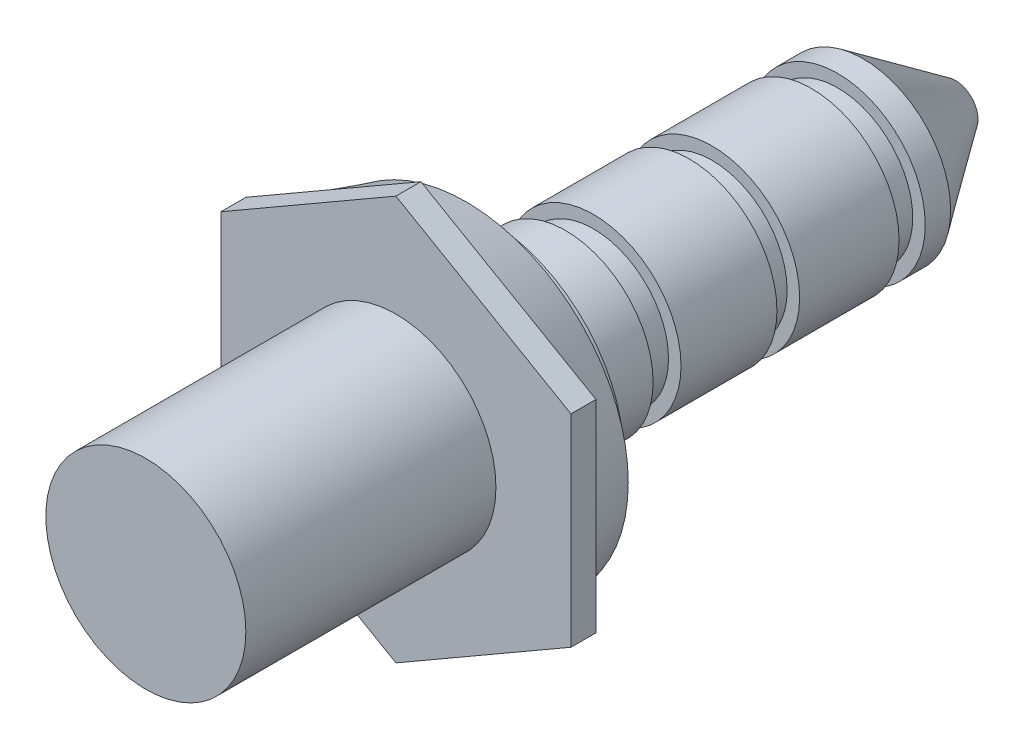
ISO-10303-21;
HEADER;
FILE_DESCRIPTION(('STEP AP214'),'2;1');
FILE_NAME('part.step','',(''),(''),'','','');
FILE_SCHEMA(('AUTOMOTIVE_DESIGN { 1 0 10303 214 1 1 1 1 }'));
ENDSEC;
DATA;
#1=APPLICATION_CONTEXT('core data for automotive mechanical design processes');
#2=APPLICATION_PROTOCOL_DEFINITION('international standard','automotive_design',2000,#1);
#3=PRODUCT_CONTEXT('',#1,'mechanical');
#4=PRODUCT('Part','Part','',(#3));
#5=PRODUCT_RELATED_PRODUCT_CATEGORY('part','',(#4));
#6=PRODUCT_DEFINITION_FORMATION('','',#4);
#7=PRODUCT_DEFINITION_CONTEXT('part definition',#1,'design');
#8=PRODUCT_DEFINITION('design','',#6,#7);
#9=PRODUCT_DEFINITION_SHAPE('','',#8);
#10=(LENGTH_UNIT() NAMED_UNIT(*) SI_UNIT(.MILLI.,.METRE.));
#11=(NAMED_UNIT(*) PLANE_ANGLE_UNIT() SI_UNIT($,.RADIAN.));
#12=(NAMED_UNIT(*) SI_UNIT($,.STERADIAN.) SOLID_ANGLE_UNIT());
#13=UNCERTAINTY_MEASURE_WITH_UNIT(LENGTH_MEASURE(1.E-05),#10,'distance_accuracy_value','');
#14=(GEOMETRIC_REPRESENTATION_CONTEXT(3) GLOBAL_UNCERTAINTY_ASSIGNED_CONTEXT((#13)) GLOBAL_UNIT_ASSIGNED_CONTEXT((#10,
#11,#12)) REPRESENTATION_CONTEXT('',''));
#15=CARTESIAN_POINT('',(0.,0.,0.));
#16=DIRECTION('',(0.,0.,1.));
#17=DIRECTION('',(1.,0.,0.));
#18=AXIS2_PLACEMENT_3D('',#15,#16,#17);
#19=CARTESIAN_POINT('',(0.,0.,0.));
#20=DIRECTION('',(0.,0.,1.));
#21=DIRECTION('',(1.,0.,0.));
#22=AXIS2_PLACEMENT_3D('',#19,#20,#21);
#23=PLANE('',#22);
#24=DIRECTION('',(0.,1.,0.));
#25=VECTOR('',#24,1.);
#26=CARTESIAN_POINT('',(7.,-4.04145188432738,0.));
#27=LINE('',#26,#25);
#28=CARTESIAN_POINT('',(7.,0.,0.));
#29=VERTEX_POINT('',#28);
#30=CARTESIAN_POINT('',(7.,4.04145188432738,0.));
#31=VERTEX_POINT('',#30);
#32=EDGE_CURVE('E143',#29,#31,#27,.T.);
#33=ORIENTED_EDGE('',*,*,#32,.F.);
#34=CARTESIAN_POINT('',(0.,0.,0.));
#35=DIRECTION('',(0.,0.,1.));
#36=DIRECTION('',(1.,0.,0.));
#37=AXIS2_PLACEMENT_3D('',#34,#35,#36);
#38=CIRCLE('',#37,7.);
#39=CARTESIAN_POINT('',(3.5,6.06217782649107,0.));
#40=VERTEX_POINT('',#39);
#41=EDGE_CURVE('E44',#29,#40,#38,.T.);
#42=ORIENTED_EDGE('',*,*,#41,.T.);
#43=DIRECTION('',(-0.866025403784439,0.5,0.));
#44=VECTOR('',#43,1.);
#45=CARTESIAN_POINT('',(7.,4.04145188432738,0.));
#46=LINE('',#45,#44);
#47=EDGE_CURVE('E147',#31,#40,#46,.T.);
#48=ORIENTED_EDGE('',*,*,#47,.F.);
#49=EDGE_LOOP('',(#33,#42,#48));
#50=FACE_BOUND('',#49,.T.);
#51=ADVANCED_FACE('F33',(#50),#23,.F.);
#52=CARTESIAN_POINT('',(0.,8.08290376865476,0.));
#53=VERTEX_POINT('',#52);
#54=EDGE_CURVE('E121',#40,#53,#46,.T.);
#55=ORIENTED_EDGE('',*,*,#54,.F.);
#56=CARTESIAN_POINT('',(-3.5,6.06217782649107,0.));
#57=VERTEX_POINT('',#56);
#58=EDGE_CURVE('E11',#40,#57,#38,.T.);
#59=ORIENTED_EDGE('',*,*,#58,.T.);
#60=DIRECTION('',(-0.866025403784439,-0.5,0.));
#61=VECTOR('',#60,1.);
#62=CARTESIAN_POINT('',(0.,8.08290376865476,0.));
#63=LINE('',#62,#61);
#64=EDGE_CURVE('E150',#53,#57,#63,.T.);
#65=ORIENTED_EDGE('',*,*,#64,.F.);
#66=EDGE_LOOP('',(#55,#59,#65));
#67=FACE_BOUND('',#66,.T.);
#68=ADVANCED_FACE('F263',(#67),#23,.F.);
#69=CARTESIAN_POINT('',(-7.,4.04145188432738,0.));
#70=VERTEX_POINT('',#69);
#71=EDGE_CURVE('E149',#57,#70,#63,.T.);
#72=ORIENTED_EDGE('',*,*,#71,.F.);
#73=CARTESIAN_POINT('',(-7.,0.,0.));
#74=VERTEX_POINT('',#73);
#75=EDGE_CURVE('E42',#57,#74,#38,.T.);
#76=ORIENTED_EDGE('',*,*,#75,.T.);
#77=DIRECTION('',(0.,-1.,0.));
#78=VECTOR('',#77,1.);
#79=CARTESIAN_POINT('',(-7.,4.04145188432738,0.));
#80=LINE('',#79,#78);
#81=EDGE_CURVE('E152',#70,#74,#80,.T.);
#82=ORIENTED_EDGE('',*,*,#81,.F.);
#83=EDGE_LOOP('',(#72,#76,#82));
#84=FACE_BOUND('',#83,.T.);
#85=ADVANCED_FACE('F258',(#84),#23,.F.);
#86=CARTESIAN_POINT('',(-7.,-4.04145188432738,0.));
#87=VERTEX_POINT('',#86);
#88=EDGE_CURVE('E86',#74,#87,#80,.T.);
#89=ORIENTED_EDGE('',*,*,#88,.F.);
#90=CARTESIAN_POINT('',(-3.5,-6.06217782649107,0.));
#91=VERTEX_POINT('',#90);
#92=EDGE_CURVE('E168',#74,#91,#38,.T.);
#93=ORIENTED_EDGE('',*,*,#92,.T.);
#94=DIRECTION('',(0.866025403784439,-0.5,0.));
#95=VECTOR('',#94,1.);
#96=CARTESIAN_POINT('',(-7.,-4.04145188432738,0.));
#97=LINE('',#96,#95);
#98=EDGE_CURVE('E135',#87,#91,#97,.T.);
#99=ORIENTED_EDGE('',*,*,#98,.F.);
#100=EDGE_LOOP('',(#89,#93,#99));
#101=FACE_BOUND('',#100,.T.);
#102=ADVANCED_FACE('F254',(#101),#23,.F.);
#103=CARTESIAN_POINT('',(0.,-8.08290376865476,0.));
#104=VERTEX_POINT('',#103);
#105=EDGE_CURVE('E139',#91,#104,#97,.T.);
#106=ORIENTED_EDGE('',*,*,#105,.F.);
#107=CARTESIAN_POINT('',(3.5,-6.06217782649107,0.));
#108=VERTEX_POINT('',#107);
#109=EDGE_CURVE('E163',#91,#108,#38,.T.);
#110=ORIENTED_EDGE('',*,*,#109,.T.);
#111=DIRECTION('',(0.866025403784439,0.5,0.));
#112=VECTOR('',#111,1.);
#113=CARTESIAN_POINT('',(0.,-8.08290376865476,0.));
#114=LINE('',#113,#112);
#115=EDGE_CURVE('E140',#104,#108,#114,.T.);
#116=ORIENTED_EDGE('',*,*,#115,.F.);
#117=EDGE_LOOP('',(#106,#110,#116));
#118=FACE_BOUND('',#117,.T.);
#119=ADVANCED_FACE('F244',(#118),#23,.F.);
#120=CARTESIAN_POINT('',(-7.,-4.04145188432738,1.));
#121=DIRECTION('',(0.5,0.866025403784439,0.));
#122=DIRECTION('',(-0.866025403784439,0.5,0.));
#123=AXIS2_PLACEMENT_3D('',#120,#121,#122);
#124=PLANE('',#123);
#125=ORIENTED_EDGE('',*,*,#98,.T.);
#126=ORIENTED_EDGE('',*,*,#105,.T.);
#127=DIRECTION('',(0.,0.,-1.));
#128=VECTOR('',#127,1.);
#129=CARTESIAN_POINT('',(0.,-8.08290376865476,1.));
#130=LINE('',#129,#128);
#131=CARTESIAN_POINT('',(0.,-8.08290376865476,1.));
#132=VERTEX_POINT('',#131);
#133=EDGE_CURVE('E37',#132,#104,#130,.T.);
#134=ORIENTED_EDGE('',*,*,#133,.F.);
#135=DIRECTION('',(0.866025403784439,-0.5,0.));
#136=VECTOR('',#135,1.);
#137=CARTESIAN_POINT('',(-7.,-4.04145188432738,1.));
#138=LINE('',#137,#136);
#139=CARTESIAN_POINT('',(-7.,-4.04145188432738,1.));
#140=VERTEX_POINT('',#139);
#141=EDGE_CURVE('E154',#140,#132,#138,.T.);
#142=ORIENTED_EDGE('',*,*,#141,.F.);
#143=DIRECTION('',(0.,0.,-1.));
#144=VECTOR('',#143,1.);
#145=CARTESIAN_POINT('',(-7.,-4.04145188432738,1.));
#146=LINE('',#145,#144);
#147=EDGE_CURVE('E131',#140,#87,#146,.T.);
#148=ORIENTED_EDGE('',*,*,#147,.T.);
#149=EDGE_LOOP('',(#125,#126,#134,#142,#148));
#150=FACE_BOUND('',#149,.T.);
#151=ADVANCED_FACE('F35',(#150),#124,.F.);
#152=CARTESIAN_POINT('',(0.,-8.08290376865476,1.));
#153=DIRECTION('',(-0.5,0.866025403784439,0.));
#154=DIRECTION('',(-0.866025403784439,-0.5,0.));
#155=AXIS2_PLACEMENT_3D('',#152,#153,#154);
#156=PLANE('',#155);
#157=ORIENTED_EDGE('',*,*,#115,.T.);
#158=CARTESIAN_POINT('',(7.,-4.04145188432738,0.));
#159=VERTEX_POINT('',#158);
#160=EDGE_CURVE('E138',#108,#159,#114,.T.);
#161=ORIENTED_EDGE('',*,*,#160,.T.);
#162=DIRECTION('',(0.,0.,-1.));
#163=VECTOR('',#162,1.);
#164=CARTESIAN_POINT('',(7.,-4.04145188432738,1.));
#165=LINE('',#164,#163);
#166=CARTESIAN_POINT('',(7.,-4.04145188432738,1.));
#167=VERTEX_POINT('',#166);
#168=EDGE_CURVE('E157',#167,#159,#165,.T.);
#169=ORIENTED_EDGE('',*,*,#168,.F.);
#170=DIRECTION('',(0.866025403784439,0.5,0.));
#171=VECTOR('',#170,1.);
#172=CARTESIAN_POINT('',(0.,-8.08290376865476,1.));
#173=LINE('',#172,#171);
#174=EDGE_CURVE('E95',#132,#167,#173,.T.);
#175=ORIENTED_EDGE('',*,*,#174,.F.);
#176=ORIENTED_EDGE('',*,*,#133,.T.);
#177=EDGE_LOOP('',(#157,#161,#169,#175,#176));
#178=FACE_BOUND('',#177,.T.);
#179=ADVANCED_FACE('F237',(#178),#156,.F.);
#180=CARTESIAN_POINT('',(7.,-4.04145188432738,1.));
#181=DIRECTION('',(-1.,0.,0.));
#182=DIRECTION('',(0.,-1.,0.));
#183=AXIS2_PLACEMENT_3D('',#180,#181,#182);
#184=PLANE('',#183);
#185=EDGE_CURVE('E144',#159,#29,#27,.T.);
#186=ORIENTED_EDGE('',*,*,#185,.T.);
#187=ORIENTED_EDGE('',*,*,#32,.T.);
#188=DIRECTION('',(0.,0.,-1.));
#189=VECTOR('',#188,1.);
#190=CARTESIAN_POINT('',(7.,4.04145188432738,1.));
#191=LINE('',#190,#189);
#192=CARTESIAN_POINT('',(7.,4.04145188432738,1.));
#193=VERTEX_POINT('',#192);
#194=EDGE_CURVE('E125',#193,#31,#191,.T.);
#195=ORIENTED_EDGE('',*,*,#194,.F.);
#196=DIRECTION('',(0.,1.,0.));
#197=VECTOR('',#196,1.);
#198=CARTESIAN_POINT('',(7.,-4.04145188432738,1.));
#199=LINE('',#198,#197);
#200=EDGE_CURVE('E111',#167,#193,#199,.T.);
#201=ORIENTED_EDGE('',*,*,#200,.F.);
#202=ORIENTED_EDGE('',*,*,#168,.T.);
#203=EDGE_LOOP('',(#186,#187,#195,#201,#202));
#204=FACE_BOUND('',#203,.T.);
#205=ADVANCED_FACE('F238',(#204),#184,.F.);
#206=CARTESIAN_POINT('',(7.,4.04145188432738,1.));
#207=DIRECTION('',(-0.5,-0.866025403784439,0.));
#208=DIRECTION('',(0.866025403784439,-0.5,0.));
#209=AXIS2_PLACEMENT_3D('',#206,#207,#208);
#210=PLANE('',#209);
#211=ORIENTED_EDGE('',*,*,#47,.T.);
#212=ORIENTED_EDGE('',*,*,#54,.T.);
#213=DIRECTION('',(0.,0.,-1.));
#214=VECTOR('',#213,1.);
#215=CARTESIAN_POINT('',(0.,8.08290376865476,1.));
#216=LINE('',#215,#214);
#217=CARTESIAN_POINT('',(0.,8.08290376865476,1.));
#218=VERTEX_POINT('',#217);
#219=EDGE_CURVE('E117',#218,#53,#216,.T.);
#220=ORIENTED_EDGE('',*,*,#219,.F.);
#221=DIRECTION('',(-0.866025403784439,0.5,0.));
#222=VECTOR('',#221,1.);
#223=CARTESIAN_POINT('',(7.,4.04145188432738,1.));
#224=LINE('',#223,#222);
#225=EDGE_CURVE('E104',#193,#218,#224,.T.);
#226=ORIENTED_EDGE('',*,*,#225,.F.);
#227=ORIENTED_EDGE('',*,*,#194,.T.);
#228=EDGE_LOOP('',(#211,#212,#220,#226,#227));
#229=FACE_BOUND('',#228,.T.);
#230=ADVANCED_FACE('F119',(#229),#210,.F.);
#231=CARTESIAN_POINT('',(0.,8.08290376865476,1.));
#232=DIRECTION('',(0.5,-0.866025403784439,0.));
#233=DIRECTION('',(0.866025403784439,0.5,0.));
#234=AXIS2_PLACEMENT_3D('',#231,#232,#233);
#235=PLANE('',#234);
#236=ORIENTED_EDGE('',*,*,#64,.T.);
#237=ORIENTED_EDGE('',*,*,#71,.T.);
#238=DIRECTION('',(0.,0.,-1.));
#239=VECTOR('',#238,1.);
#240=CARTESIAN_POINT('',(-7.,4.04145188432738,1.));
#241=LINE('',#240,#239);
#242=CARTESIAN_POINT('',(-7.,4.04145188432738,1.));
#243=VERTEX_POINT('',#242);
#244=EDGE_CURVE('E126',#243,#70,#241,.T.);
#245=ORIENTED_EDGE('',*,*,#244,.F.);
#246=DIRECTION('',(-0.866025403784439,-0.5,0.));
#247=VECTOR('',#246,1.);
#248=CARTESIAN_POINT('',(0.,8.08290376865476,1.));
#249=LINE('',#248,#247);
#250=EDGE_CURVE('E108',#218,#243,#249,.T.);
#251=ORIENTED_EDGE('',*,*,#250,.F.);
#252=ORIENTED_EDGE('',*,*,#219,.T.);
#253=EDGE_LOOP('',(#236,#237,#245,#251,#252));
#254=FACE_BOUND('',#253,.T.);
#255=ADVANCED_FACE('F128',(#254),#235,.F.);
#256=CARTESIAN_POINT('',(-7.,4.04145188432738,1.));
#257=DIRECTION('',(1.,0.,0.));
#258=DIRECTION('',(0.,0.,-1.));
#259=AXIS2_PLACEMENT_3D('',#256,#257,#258);
#260=PLANE('',#259);
#261=ORIENTED_EDGE('',*,*,#81,.T.);
#262=ORIENTED_EDGE('',*,*,#88,.T.);
#263=ORIENTED_EDGE('',*,*,#147,.F.);
#264=DIRECTION('',(0.,-1.,0.));
#265=VECTOR('',#264,1.);
#266=CARTESIAN_POINT('',(-7.,4.04145188432738,1.));
#267=LINE('',#266,#265);
#268=EDGE_CURVE('E59',#243,#140,#267,.T.);
#269=ORIENTED_EDGE('',*,*,#268,.F.);
#270=ORIENTED_EDGE('',*,*,#244,.T.);
#271=EDGE_LOOP('',(#261,#262,#263,#269,#270));
#272=FACE_BOUND('',#271,.T.);
#273=ADVANCED_FACE('F265',(#272),#260,.F.);
#274=CARTESIAN_POINT('',(0.,0.,1.));
#275=DIRECTION('',(0.,0.,1.));
#276=DIRECTION('',(1.,0.,0.));
#277=AXIS2_PLACEMENT_3D('',#274,#275,#276);
#278=PLANE('',#277);
#279=CARTESIAN_POINT('',(0.,0.,1.));
#280=DIRECTION('',(0.,0.,1.));
#281=DIRECTION('',(1.,0.,0.));
#282=AXIS2_PLACEMENT_3D('',#279,#280,#281);
#283=CIRCLE('',#282,4.);
#284=CARTESIAN_POINT('',(4.,0.,1.));
#285=VERTEX_POINT('',#284);
#286=EDGE_CURVE('E229',#285,#285,#283,.T.);
#287=ORIENTED_EDGE('',*,*,#286,.F.);
#288=EDGE_LOOP('',(#287));
#289=FACE_BOUND('',#288,.T.);
#290=ORIENTED_EDGE('',*,*,#141,.T.);
#291=ORIENTED_EDGE('',*,*,#174,.T.);
#292=ORIENTED_EDGE('',*,*,#200,.T.);
#293=ORIENTED_EDGE('',*,*,#225,.T.);
#294=ORIENTED_EDGE('',*,*,#250,.T.);
#295=ORIENTED_EDGE('',*,*,#268,.T.);
#296=EDGE_LOOP('',(#290,#291,#292,#293,#294,#295));
#297=FACE_BOUND('',#296,.T.);
#298=ADVANCED_FACE('F106',(#289,#297),#278,.T.);
#299=ORIENTED_EDGE('',*,*,#160,.F.);
#300=EDGE_CURVE('E161',#108,#29,#38,.T.);
#301=ORIENTED_EDGE('',*,*,#300,.T.);
#302=ORIENTED_EDGE('',*,*,#185,.F.);
#303=EDGE_LOOP('',(#299,#301,#302));
#304=FACE_BOUND('',#303,.T.);
#305=ADVANCED_FACE('F239',(#304),#23,.F.);
#306=CARTESIAN_POINT('',(0.,0.,11.));
#307=DIRECTION('',(0.,0.,-1.));
#308=DIRECTION('',(-1.,0.,0.));
#309=AXIS2_PLACEMENT_3D('',#306,#307,#308);
#310=CYLINDRICAL_SURFACE('',#309,4.);
#311=CARTESIAN_POINT('',(0.,0.,11.));
#312=DIRECTION('',(0.,0.,1.));
#313=DIRECTION('',(1.,0.,0.));
#314=AXIS2_PLACEMENT_3D('',#311,#312,#313);
#315=CIRCLE('',#314,4.);
#316=CARTESIAN_POINT('',(4.,0.,11.));
#317=VERTEX_POINT('',#316);
#318=EDGE_CURVE('E230',#317,#317,#315,.T.);
#319=ORIENTED_EDGE('',*,*,#318,.F.);
#320=EDGE_LOOP('',(#319));
#321=FACE_BOUND('',#320,.T.);
#322=ORIENTED_EDGE('',*,*,#286,.T.);
#323=EDGE_LOOP('',(#322));
#324=FACE_BOUND('',#323,.T.);
#325=ADVANCED_FACE('F280',(#321,#324),#310,.T.);
#326=CARTESIAN_POINT('',(0.,0.,11.));
#327=DIRECTION('',(0.,0.,1.));
#328=DIRECTION('',(1.,0.,0.));
#329=AXIS2_PLACEMENT_3D('',#326,#327,#328);
#330=PLANE('',#329);
#331=ORIENTED_EDGE('',*,*,#318,.T.);
#332=EDGE_LOOP('',(#331));
#333=FACE_BOUND('',#332,.T.);
#334=ADVANCED_FACE('F285',(#333),#330,.T.);
#335=CARTESIAN_POINT('',(0.,0.,-21.3821255905452));
#336=DIRECTION('',(0.,0.,-1.));
#337=DIRECTION('',(-1.,0.,0.));
#338=AXIS2_PLACEMENT_3D('',#335,#336,#337);
#339=PLANE('',#338);
#340=CARTESIAN_POINT('',(0.,0.,-21.3821255905452));
#341=DIRECTION('',(0.,0.,1.));
#342=DIRECTION('',(1.,0.,0.));
#343=AXIS2_PLACEMENT_3D('',#340,#341,#342);
#344=CIRCLE('',#343,0.894479356480703);
#345=CARTESIAN_POINT('',(0.894479356480702,0.,-21.3821255905452));
#346=VERTEX_POINT('',#345);
#347=EDGE_CURVE('E226',#346,#346,#344,.T.);
#348=ORIENTED_EDGE('',*,*,#347,.F.);
#349=EDGE_LOOP('',(#348));
#350=FACE_BOUND('',#349,.T.);
#351=ADVANCED_FACE('F296',(#350),#339,.T.);
#352=CARTESIAN_POINT('',(0.,0.,-17.6825292365084));
#353=DIRECTION('',(0.,0.,1.));
#354=DIRECTION('',(1.,0.,0.));
#355=AXIS2_PLACEMENT_3D('',#352,#353,#354);
#356=CONICAL_SURFACE('',#355,3.5,0.613587060562772);
#357=CARTESIAN_POINT('',(0.,0.,-17.6825292365084));
#358=DIRECTION('',(0.,0.,1.));
#359=DIRECTION('',(1.,0.,0.));
#360=AXIS2_PLACEMENT_3D('',#357,#358,#359);
#361=CIRCLE('',#360,3.5);
#362=CARTESIAN_POINT('',(3.5,0.,-17.6825292365084));
#363=VERTEX_POINT('',#362);
#364=EDGE_CURVE('E223',#363,#363,#361,.T.);
#365=CARTESIAN_POINT('',(0.894479356480702,0.,-21.3821255905452));
#366=CARTESIAN_POINT('',(0.921620196517361,0.,-21.3435881285239));
#367=CARTESIAN_POINT('',(0.94876103655402,0.,-21.3050506665027));
#368=CARTESIAN_POINT('',(1.00304271662734,0.,-21.2279757424603));
#369=CARTESIAN_POINT('',(1.030183556664,0.,-21.1894382804391));
#370=CARTESIAN_POINT('',(1.08446523673732,0.,-21.1123633563966));
#371=CARTESIAN_POINT('',(1.11160607677398,0.,-21.0738258943754));
#372=CARTESIAN_POINT('',(1.16588775684729,0.,-20.996750970333));
#373=CARTESIAN_POINT('',(1.19302859688395,0.,-20.9582135083118));
#374=CARTESIAN_POINT('',(1.24731027695727,0.,-20.8811385842693));
#375=CARTESIAN_POINT('',(1.27445111699393,0.,-20.8426011222481));
#376=CARTESIAN_POINT('',(1.32873279706725,0.,-20.7655261982057));
#377=CARTESIAN_POINT('',(1.35587363710391,0.,-20.7269887361845));
#378=CARTESIAN_POINT('',(1.41015531717723,0.,-20.649913812142));
#379=CARTESIAN_POINT('',(1.43729615721389,0.,-20.6113763501208));
#380=CARTESIAN_POINT('',(1.49157783728721,0.,-20.5343014260784));
#381=CARTESIAN_POINT('',(1.51871867732387,0.,-20.4957639640572));
#382=CARTESIAN_POINT('',(1.57300035739719,0.,-20.4186890400148));
#383=CARTESIAN_POINT('',(1.60014119743384,0.,-20.3801515779935));
#384=CARTESIAN_POINT('',(1.65442287750716,0.,-20.3030766539511));
#385=CARTESIAN_POINT('',(1.68156371754382,0.,-20.2645391919299));
#386=CARTESIAN_POINT('',(1.73584539761714,0.,-20.1874642678875));
#387=CARTESIAN_POINT('',(1.7629862376538,0.,-20.1489268058662));
#388=CARTESIAN_POINT('',(1.81726791772712,0.,-20.0718518818238));
#389=CARTESIAN_POINT('',(1.84440875776378,0.,-20.0333144198026));
#390=CARTESIAN_POINT('',(1.8986904378371,0.,-19.9562394957602));
#391=CARTESIAN_POINT('',(1.92583127787376,0.,-19.9177020337389));
#392=CARTESIAN_POINT('',(1.98011295794708,0.,-19.8406271096965));
#393=CARTESIAN_POINT('',(2.00725379798373,0.,-19.8020896476753));
#394=CARTESIAN_POINT('',(2.06153547805705,0.,-19.7250147236329));
#395=CARTESIAN_POINT('',(2.08867631809371,0.,-19.6864772616116));
#396=CARTESIAN_POINT('',(2.14295799816703,0.,-19.6094023375692));
#397=CARTESIAN_POINT('',(2.17009883820369,0.,-19.570864875548));
#398=CARTESIAN_POINT('',(2.22438051827701,0.,-19.4937899515056));
#399=CARTESIAN_POINT('',(2.25152135831367,0.,-19.4552524894844));
#400=CARTESIAN_POINT('',(2.30580303838699,0.,-19.3781775654419));
#401=CARTESIAN_POINT('',(2.33294387842365,0.,-19.3396401034207));
#402=CARTESIAN_POINT('',(2.38722555849697,0.,-19.2625651793783));
#403=CARTESIAN_POINT('',(2.41436639853363,0.,-19.2240277173571));
#404=CARTESIAN_POINT('',(2.46864807860694,0.,-19.1469527933146));
#405=CARTESIAN_POINT('',(2.4957889186436,0.,-19.1084153312934));
#406=CARTESIAN_POINT('',(2.55007059871692,0.,-19.031340407251));
#407=CARTESIAN_POINT('',(2.57721143875358,0.,-18.9928029452298));
#408=CARTESIAN_POINT('',(2.6314931188269,0.,-18.9157280211873));
#409=CARTESIAN_POINT('',(2.65863395886356,0.,-18.8771905591661));
#410=CARTESIAN_POINT('',(2.71291563893688,0.,-18.8001156351237));
#411=CARTESIAN_POINT('',(2.74005647897354,0.,-18.7615781731025));
#412=CARTESIAN_POINT('',(2.79433815904686,0.,-18.68450324906));
#413=CARTESIAN_POINT('',(2.82147899908352,0.,-18.6459657870388));
#414=CARTESIAN_POINT('',(2.87576067915683,0.,-18.5688908629964));
#415=CARTESIAN_POINT('',(2.90290151919349,0.,-18.5303534009752));
#416=CARTESIAN_POINT('',(2.95718319926681,0.,-18.4532784769327));
#417=CARTESIAN_POINT('',(2.98432403930347,0.,-18.4147410149115));
#418=CARTESIAN_POINT('',(3.03860571937679,0.,-18.3376660908691));
#419=CARTESIAN_POINT('',(3.06574655941345,0.,-18.2991286288479));
#420=CARTESIAN_POINT('',(3.12002823948677,0.,-18.2220537048054));
#421=CARTESIAN_POINT('',(3.14716907952343,0.,-18.1835162427842));
#422=CARTESIAN_POINT('',(3.20145075959675,0.,-18.1064413187418));
#423=CARTESIAN_POINT('',(3.22859159963341,0.,-18.0679038567206));
#424=CARTESIAN_POINT('',(3.28287327970672,0.,-17.9908289326781));
#425=CARTESIAN_POINT('',(3.31001411974338,0.,-17.9522914706569));
#426=CARTESIAN_POINT('',(3.3642957998167,0.,-17.8752165466145));
#427=CARTESIAN_POINT('',(3.39143663985336,0.,-17.8366790845933));
#428=CARTESIAN_POINT('',(3.44571831992668,0.,-17.7596041605508));
#429=CARTESIAN_POINT('',(3.47285915996334,0.,-17.7210666985296));
#430=CARTESIAN_POINT('',(3.5,0.,-17.6825292365084));
#431=B_SPLINE_CURVE_WITH_KNOTS('',3,(#365,#366,#367,#368,#369,#370,#371,#372,#373,#374,#375,
#376,#377,#378,#379,#380,#381,#382,#383,#384,#385,#386,#387,#388,#389,#390,#391,#392,#393,#394,
#395,#396,#397,#398,#399,#400,#401,#402,#403,#404,#405,#406,#407,#408,#409,#410,#411,#412,#413,
#414,#415,#416,#417,#418,#419,#420,#421,#422,#423,#424,#425,#426,#427,#428,#429,#430),
.UNSPECIFIED.,.F.,.F.,(4,2,2,2,2,2,2,2,2,2,2,2,2,2,2,2,2,2,2,2,2,2,2,2,2,2,2,2,2,2,2,2,4),(0.,
0.141406685105018,0.282813370210035,0.424220055315053,0.565626740420071,0.707033425525088,
0.848440110630109,0.989846795735126,1.13125348084014,1.27266016594516,1.41406685105018,
1.5554735361552,1.69688022126022,1.83828690636524,1.97969359147025,2.12110027657527,
2.26250696168029,2.40391364678531,2.54532033189033,2.68672701699534,2.82813370210036,
2.96954038720538,3.1109470723104,3.25235375741542,3.39376044252044,3.53516712762545,
3.67657381273047,3.81798049783549,3.95938718294051,4.10079386804553,4.24220055315054,
4.38360723825556,4.52501392336058),.UNSPECIFIED.);
#432=EDGE_CURVE('BSEAM300',#346,#363,#431,.T.);
#433=ORIENTED_EDGE('',*,*,#347,.T.);
#434=ORIENTED_EDGE('',*,*,#364,.F.);
#435=ORIENTED_EDGE('',*,*,#432,.T.);
#436=ORIENTED_EDGE('',*,*,#432,.F.);
#437=EDGE_LOOP('',(#433,#435,#434,#436));
#438=FACE_BOUND('',#437,.T.);
#439=ADVANCED_FACE('F300',(#438),#356,.T.);
#440=CARTESIAN_POINT('',(0.,0.,0.));
#441=DIRECTION('',(0.,0.,1.));
#442=DIRECTION('',(1.,0.,0.));
#443=AXIS2_PLACEMENT_3D('',#440,#441,#442);
#444=CYLINDRICAL_SURFACE('',#443,3.5);
#445=ORIENTED_EDGE('',*,*,#364,.T.);
#446=EDGE_LOOP('',(#445));
#447=FACE_BOUND('',#446,.T.);
#448=CARTESIAN_POINT('',(0.,0.,-16.666829394691));
#449=DIRECTION('',(0.,0.,1.));
#450=DIRECTION('',(1.,0.,0.));
#451=AXIS2_PLACEMENT_3D('',#448,#449,#450);
#452=CIRCLE('',#451,3.5);
#453=CARTESIAN_POINT('',(3.5,0.,-16.666829394691));
#454=VERTEX_POINT('',#453);
#455=EDGE_CURVE('E220',#454,#454,#452,.T.);
#456=ORIENTED_EDGE('',*,*,#455,.F.);
#457=EDGE_LOOP('',(#456));
#458=FACE_BOUND('',#457,.T.);
#459=ADVANCED_FACE('F304',(#447,#458),#444,.T.);
#460=CARTESIAN_POINT('',(3.5,0.,-16.666829394691));
#461=DIRECTION('',(0.,0.,1.));
#462=DIRECTION('',(1.,0.,0.));
#463=AXIS2_PLACEMENT_3D('',#460,#461,#462);
#464=PLANE('',#463);
#465=ORIENTED_EDGE('',*,*,#455,.T.);
#466=EDGE_LOOP('',(#465));
#467=FACE_BOUND('',#466,.T.);
#468=CARTESIAN_POINT('',(0.,0.,-16.666829394691));
#469=DIRECTION('',(0.,0.,1.));
#470=DIRECTION('',(1.,0.,0.));
#471=AXIS2_PLACEMENT_3D('',#468,#469,#470);
#472=CIRCLE('',#471,3.);
#473=CARTESIAN_POINT('',(3.,0.,-16.666829394691));
#474=VERTEX_POINT('',#473);
#475=EDGE_CURVE('E217',#474,#474,#472,.T.);
#476=ORIENTED_EDGE('',*,*,#475,.F.);
#477=EDGE_LOOP('',(#476));
#478=FACE_BOUND('',#477,.T.);
#479=ADVANCED_FACE('F308',(#467,#478),#464,.T.);
#480=CARTESIAN_POINT('',(0.,0.,0.));
#481=DIRECTION('',(0.,0.,1.));
#482=DIRECTION('',(1.,0.,0.));
#483=AXIS2_PLACEMENT_3D('',#480,#481,#482);
#484=CYLINDRICAL_SURFACE('',#483,3.);
#485=ORIENTED_EDGE('',*,*,#475,.T.);
#486=EDGE_LOOP('',(#485));
#487=FACE_BOUND('',#486,.T.);
#488=CARTESIAN_POINT('',(0.,0.,-15.6204633482037));
#489=DIRECTION('',(0.,0.,1.));
#490=DIRECTION('',(1.,0.,0.));
#491=AXIS2_PLACEMENT_3D('',#488,#489,#490);
#492=CIRCLE('',#491,3.);
#493=CARTESIAN_POINT('',(3.,0.,-15.6204633482037));
#494=VERTEX_POINT('',#493);
#495=EDGE_CURVE('E214',#494,#494,#492,.T.);
#496=ORIENTED_EDGE('',*,*,#495,.F.);
#497=EDGE_LOOP('',(#496));
#498=FACE_BOUND('',#497,.T.);
#499=ADVANCED_FACE('F312',(#487,#498),#484,.T.);
#500=CARTESIAN_POINT('',(3.,0.,-15.6204633482037));
#501=DIRECTION('',(0.,0.,-1.));
#502=DIRECTION('',(-1.,0.,0.));
#503=AXIS2_PLACEMENT_3D('',#500,#501,#502);
#504=PLANE('',#503);
#505=ORIENTED_EDGE('',*,*,#495,.T.);
#506=EDGE_LOOP('',(#505));
#507=FACE_BOUND('',#506,.T.);
#508=CARTESIAN_POINT('',(0.,0.,-15.6204633482037));
#509=DIRECTION('',(0.,0.,1.));
#510=DIRECTION('',(1.,0.,0.));
#511=AXIS2_PLACEMENT_3D('',#508,#509,#510);
#512=CIRCLE('',#511,3.5);
#513=CARTESIAN_POINT('',(3.5,0.,-15.6204633482037));
#514=VERTEX_POINT('',#513);
#515=EDGE_CURVE('E211',#514,#514,#512,.T.);
#516=ORIENTED_EDGE('',*,*,#515,.F.);
#517=EDGE_LOOP('',(#516));
#518=FACE_BOUND('',#517,.T.);
#519=ADVANCED_FACE('F316',(#507,#518),#504,.T.);
#520=CARTESIAN_POINT('',(0.,0.,0.));
#521=DIRECTION('',(0.,0.,1.));
#522=DIRECTION('',(1.,0.,0.));
#523=AXIS2_PLACEMENT_3D('',#520,#521,#522);
#524=CYLINDRICAL_SURFACE('',#523,3.5);
#525=ORIENTED_EDGE('',*,*,#515,.T.);
#526=EDGE_LOOP('',(#525));
#527=FACE_BOUND('',#526,.T.);
#528=CARTESIAN_POINT('',(0.,0.,-11.6442723715519));
#529=DIRECTION('',(0.,0.,1.));
#530=DIRECTION('',(1.,0.,0.));
#531=AXIS2_PLACEMENT_3D('',#528,#529,#530);
#532=CIRCLE('',#531,3.5);
#533=CARTESIAN_POINT('',(3.5,0.,-11.6442723715519));
#534=VERTEX_POINT('',#533);
#535=EDGE_CURVE('E208',#534,#534,#532,.T.);
#536=ORIENTED_EDGE('',*,*,#535,.F.);
#537=EDGE_LOOP('',(#536));
#538=FACE_BOUND('',#537,.T.);
#539=ADVANCED_FACE('F320',(#527,#538),#524,.T.);
#540=CARTESIAN_POINT('',(3.5,0.,-11.6442723715519));
#541=DIRECTION('',(0.,0.,1.));
#542=DIRECTION('',(1.,0.,0.));
#543=AXIS2_PLACEMENT_3D('',#540,#541,#542);
#544=PLANE('',#543);
#545=ORIENTED_EDGE('',*,*,#535,.T.);
#546=EDGE_LOOP('',(#545));
#547=FACE_BOUND('',#546,.T.);
#548=CARTESIAN_POINT('',(0.,0.,-11.6442723715519));
#549=DIRECTION('',(0.,0.,1.));
#550=DIRECTION('',(1.,0.,0.));
#551=AXIS2_PLACEMENT_3D('',#548,#549,#550);
#552=CIRCLE('',#551,3.);
#553=CARTESIAN_POINT('',(3.,0.,-11.6442723715519));
#554=VERTEX_POINT('',#553);
#555=EDGE_CURVE('E205',#554,#554,#552,.T.);
#556=ORIENTED_EDGE('',*,*,#555,.F.);
#557=EDGE_LOOP('',(#556));
#558=FACE_BOUND('',#557,.T.);
#559=ADVANCED_FACE('F324',(#547,#558),#544,.T.);
#560=CARTESIAN_POINT('',(0.,0.,0.));
#561=DIRECTION('',(0.,0.,1.));
#562=DIRECTION('',(1.,0.,0.));
#563=AXIS2_PLACEMENT_3D('',#560,#561,#562);
#564=CYLINDRICAL_SURFACE('',#563,3.);
#565=ORIENTED_EDGE('',*,*,#555,.T.);
#566=EDGE_LOOP('',(#565));
#567=FACE_BOUND('',#566,.T.);
#568=CARTESIAN_POINT('',(0.,0.,-10.7374217979296));
#569=DIRECTION('',(0.,0.,1.));
#570=DIRECTION('',(1.,0.,0.));
#571=AXIS2_PLACEMENT_3D('',#568,#569,#570);
#572=CIRCLE('',#571,3.);
#573=CARTESIAN_POINT('',(3.,0.,-10.7374217979296));
#574=VERTEX_POINT('',#573);
#575=EDGE_CURVE('E202',#574,#574,#572,.T.);
#576=ORIENTED_EDGE('',*,*,#575,.F.);
#577=EDGE_LOOP('',(#576));
#578=FACE_BOUND('',#577,.T.);
#579=ADVANCED_FACE('F328',(#567,#578),#564,.T.);
#580=CARTESIAN_POINT('',(3.,0.,-10.7374217979296));
#581=DIRECTION('',(0.,0.,-1.));
#582=DIRECTION('',(-1.,0.,0.));
#583=AXIS2_PLACEMENT_3D('',#580,#581,#582);
#584=PLANE('',#583);
#585=ORIENTED_EDGE('',*,*,#575,.T.);
#586=EDGE_LOOP('',(#585));
#587=FACE_BOUND('',#586,.T.);
#588=CARTESIAN_POINT('',(0.,0.,-10.7374217979296));
#589=DIRECTION('',(0.,0.,1.));
#590=DIRECTION('',(1.,0.,0.));
#591=AXIS2_PLACEMENT_3D('',#588,#589,#590);
#592=CIRCLE('',#591,3.5);
#593=CARTESIAN_POINT('',(3.5,0.,-10.7374217979296));
#594=VERTEX_POINT('',#593);
#595=EDGE_CURVE('E199',#594,#594,#592,.T.);
#596=ORIENTED_EDGE('',*,*,#595,.F.);
#597=EDGE_LOOP('',(#596));
#598=FACE_BOUND('',#597,.T.);
#599=ADVANCED_FACE('F332',(#587,#598),#584,.T.);
#600=CARTESIAN_POINT('',(0.,0.,0.));
#601=DIRECTION('',(0.,0.,1.));
#602=DIRECTION('',(1.,0.,0.));
#603=AXIS2_PLACEMENT_3D('',#600,#601,#602);
#604=CYLINDRICAL_SURFACE('',#603,3.5);
#605=ORIENTED_EDGE('',*,*,#595,.T.);
#606=EDGE_LOOP('',(#605));
#607=FACE_BOUND('',#606,.T.);
#608=CARTESIAN_POINT('',(0.,0.,-6.90074629414274));
#609=DIRECTION('',(0.,0.,1.));
#610=DIRECTION('',(1.,0.,0.));
#611=AXIS2_PLACEMENT_3D('',#608,#609,#610);
#612=CIRCLE('',#611,3.5);
#613=CARTESIAN_POINT('',(3.5,0.,-6.90074629414274));
#614=VERTEX_POINT('',#613);
#615=EDGE_CURVE('E196',#614,#614,#612,.T.);
#616=ORIENTED_EDGE('',*,*,#615,.F.);
#617=EDGE_LOOP('',(#616));
#618=FACE_BOUND('',#617,.T.);
#619=ADVANCED_FACE('F336',(#607,#618),#604,.T.);
#620=CARTESIAN_POINT('',(3.5,0.,-6.90074629414274));
#621=DIRECTION('',(0.,0.,1.));
#622=DIRECTION('',(1.,0.,0.));
#623=AXIS2_PLACEMENT_3D('',#620,#621,#622);
#624=PLANE('',#623);
#625=ORIENTED_EDGE('',*,*,#615,.T.);
#626=EDGE_LOOP('',(#625));
#627=FACE_BOUND('',#626,.T.);
#628=CARTESIAN_POINT('',(0.,0.,-6.90074629414274));
#629=DIRECTION('',(0.,0.,1.));
#630=DIRECTION('',(1.,0.,0.));
#631=AXIS2_PLACEMENT_3D('',#628,#629,#630);
#632=CIRCLE('',#631,3.);
#633=CARTESIAN_POINT('',(3.,0.,-6.90074629414274));
#634=VERTEX_POINT('',#633);
#635=EDGE_CURVE('E193',#634,#634,#632,.T.);
#636=ORIENTED_EDGE('',*,*,#635,.F.);
#637=EDGE_LOOP('',(#636));
#638=FACE_BOUND('',#637,.T.);
#639=ADVANCED_FACE('F340',(#627,#638),#624,.T.);
#640=CARTESIAN_POINT('',(0.,0.,0.));
#641=DIRECTION('',(0.,0.,1.));
#642=DIRECTION('',(1.,0.,0.));
#643=AXIS2_PLACEMENT_3D('',#640,#641,#642);
#644=CYLINDRICAL_SURFACE('',#643,3.);
#645=ORIENTED_EDGE('',*,*,#635,.T.);
#646=EDGE_LOOP('',(#645));
#647=FACE_BOUND('',#646,.T.);
#648=CARTESIAN_POINT('',(0.,0.,-5.78462251122294));
#649=DIRECTION('',(0.,0.,1.));
#650=DIRECTION('',(1.,0.,0.));
#651=AXIS2_PLACEMENT_3D('',#648,#649,#650);
#652=CIRCLE('',#651,3.);
#653=CARTESIAN_POINT('',(3.,0.,-5.78462251122294));
#654=VERTEX_POINT('',#653);
#655=EDGE_CURVE('E190',#654,#654,#652,.T.);
#656=ORIENTED_EDGE('',*,*,#655,.F.);
#657=EDGE_LOOP('',(#656));
#658=FACE_BOUND('',#657,.T.);
#659=ADVANCED_FACE('F344',(#647,#658),#644,.T.);
#660=CARTESIAN_POINT('',(3.,0.,-5.78462251122294));
#661=DIRECTION('',(0.,0.,-1.));
#662=DIRECTION('',(-1.,0.,0.));
#663=AXIS2_PLACEMENT_3D('',#660,#661,#662);
#664=PLANE('',#663);
#665=ORIENTED_EDGE('',*,*,#655,.T.);
#666=EDGE_LOOP('',(#665));
#667=FACE_BOUND('',#666,.T.);
#668=CARTESIAN_POINT('',(0.,0.,-5.78462251122294));
#669=DIRECTION('',(0.,0.,1.));
#670=DIRECTION('',(1.,0.,0.));
#671=AXIS2_PLACEMENT_3D('',#668,#669,#670);
#672=CIRCLE('',#671,3.5);
#673=CARTESIAN_POINT('',(3.5,0.,-5.78462251122294));
#674=VERTEX_POINT('',#673);
#675=EDGE_CURVE('E187',#674,#674,#672,.T.);
#676=ORIENTED_EDGE('',*,*,#675,.F.);
#677=EDGE_LOOP('',(#676));
#678=FACE_BOUND('',#677,.T.);
#679=ADVANCED_FACE('F348',(#667,#678),#664,.T.);
#680=CARTESIAN_POINT('',(0.,0.,0.));
#681=DIRECTION('',(0.,0.,1.));
#682=DIRECTION('',(1.,0.,0.));
#683=AXIS2_PLACEMENT_3D('',#680,#681,#682);
#684=CYLINDRICAL_SURFACE('',#683,3.5);
#685=ORIENTED_EDGE('',*,*,#675,.T.);
#686=EDGE_LOOP('',(#685));
#687=FACE_BOUND('',#686,.T.);
#688=CARTESIAN_POINT('',(0.,0.,-2.645524371761));
#689=DIRECTION('',(0.,0.,1.));
#690=DIRECTION('',(1.,0.,0.));
#691=AXIS2_PLACEMENT_3D('',#688,#689,#690);
#692=CIRCLE('',#691,3.5);
#693=CARTESIAN_POINT('',(3.5,0.,-2.645524371761));
#694=VERTEX_POINT('',#693);
#695=EDGE_CURVE('E184',#694,#694,#692,.T.);
#696=ORIENTED_EDGE('',*,*,#695,.F.);
#697=EDGE_LOOP('',(#696));
#698=FACE_BOUND('',#697,.T.);
#699=ADVANCED_FACE('F352',(#687,#698),#684,.T.);
#700=CARTESIAN_POINT('',(3.5,0.,-2.645524371761));
#701=DIRECTION('',(0.,0.,-1.));
#702=DIRECTION('',(-1.,0.,0.));
#703=AXIS2_PLACEMENT_3D('',#700,#701,#702);
#704=PLANE('',#703);
#705=ORIENTED_EDGE('',*,*,#695,.T.);
#706=EDGE_LOOP('',(#705));
#707=FACE_BOUND('',#706,.T.);
#708=CARTESIAN_POINT('',(0.,0.,-2.645524371761));
#709=DIRECTION('',(0.,0.,1.));
#710=DIRECTION('',(1.,0.,0.));
#711=AXIS2_PLACEMENT_3D('',#708,#709,#710);
#712=CIRCLE('',#711,5.46741564375747);
#713=CARTESIAN_POINT('',(5.46741564375747,0.,-2.645524371761));
#714=VERTEX_POINT('',#713);
#715=EDGE_CURVE('E179',#714,#714,#712,.T.);
#716=ORIENTED_EDGE('',*,*,#715,.F.);
#717=EDGE_LOOP('',(#716));
#718=FACE_BOUND('',#717,.T.);
#719=ADVANCED_FACE('F356',(#707,#718),#704,.T.);
#720=CARTESIAN_POINT('',(0.,0.,0.));
#721=DIRECTION('',(0.,0.,1.));
#722=DIRECTION('',(1.,0.,0.));
#723=AXIS2_PLACEMENT_3D('',#720,#721,#722);
#724=CYLINDRICAL_SURFACE('',#723,5.46741564375747);
#725=ORIENTED_EDGE('',*,*,#715,.T.);
#726=EDGE_LOOP('',(#725));
#727=FACE_BOUND('',#726,.T.);
#728=CARTESIAN_POINT('',(0.,0.,-1.80843153457114));
#729=DIRECTION('',(0.,0.,1.));
#730=DIRECTION('',(1.,0.,0.));
#731=AXIS2_PLACEMENT_3D('',#728,#729,#730);
#732=CIRCLE('',#731,5.46741564375747);
#733=CARTESIAN_POINT('',(5.46741564375747,0.,-1.80843153457114));
#734=VERTEX_POINT('',#733);
#735=EDGE_CURVE('E175',#734,#734,#732,.T.);
#736=ORIENTED_EDGE('',*,*,#735,.F.);
#737=EDGE_LOOP('',(#736));
#738=FACE_BOUND('',#737,.T.);
#739=ADVANCED_FACE('F360',(#727,#738),#724,.T.);
#740=CARTESIAN_POINT('',(5.46741564375747,0.,-1.80843153457114));
#741=DIRECTION('',(0.,0.,-1.));
#742=DIRECTION('',(-1.,0.,0.));
#743=AXIS2_PLACEMENT_3D('',#740,#741,#742);
#744=PLANE('',#743);
#745=ORIENTED_EDGE('',*,*,#735,.T.);
#746=EDGE_LOOP('',(#745));
#747=FACE_BOUND('',#746,.T.);
#748=CARTESIAN_POINT('',(0.,0.,-1.80843153457114));
#749=DIRECTION('',(0.,0.,1.));
#750=DIRECTION('',(1.,0.,0.));
#751=AXIS2_PLACEMENT_3D('',#748,#749,#750);
#752=CIRCLE('',#751,6.48311548557485);
#753=CARTESIAN_POINT('',(6.48311548557485,0.,-1.80843153457114));
#754=VERTEX_POINT('',#753);
#755=EDGE_CURVE('E170',#754,#754,#752,.T.);
#756=ORIENTED_EDGE('',*,*,#755,.F.);
#757=EDGE_LOOP('',(#756));
#758=FACE_BOUND('',#757,.T.);
#759=ADVANCED_FACE('F364',(#747,#758),#744,.T.);
#760=CARTESIAN_POINT('',(0.,0.,0.));
#761=DIRECTION('',(0.,0.,1.));
#762=DIRECTION('',(1.,0.,0.));
#763=AXIS2_PLACEMENT_3D('',#760,#761,#762);
#764=CONICAL_SURFACE('',#763,7.,0.27839668319462);
#765=ORIENTED_EDGE('',*,*,#755,.T.);
#766=EDGE_LOOP('',(#765));
#767=FACE_BOUND('',#766,.T.);
#768=ORIENTED_EDGE('',*,*,#41,.F.);
#769=ORIENTED_EDGE('',*,*,#300,.F.);
#770=ORIENTED_EDGE('',*,*,#109,.F.);
#771=ORIENTED_EDGE('',*,*,#92,.F.);
#772=ORIENTED_EDGE('',*,*,#75,.F.);
#773=ORIENTED_EDGE('',*,*,#58,.F.);
#774=EDGE_LOOP('',(#768,#769,#770,#771,#772,#773));
#775=FACE_BOUND('',#774,.T.);
#776=ADVANCED_FACE('F248',(#767,#775),#764,.T.);
#777=CLOSED_SHELL('',(#51,#68,#85,#102,#119,#151,#179,#205,#230,#255,#273,#298,#305,#325,#334,
#351,#439,#459,#479,#499,#519,#539,#559,#579,#599,#619,#639,#659,#679,#699,#719,#739,#759,#776));
#778=MANIFOLD_SOLID_BREP('B2',#777);
#779=ADVANCED_BREP_SHAPE_REPRESENTATION('',(#18,#778),#14);
#780=SHAPE_DEFINITION_REPRESENTATION(#9,#779);
ENDSEC;
END-ISO-10303-21;
